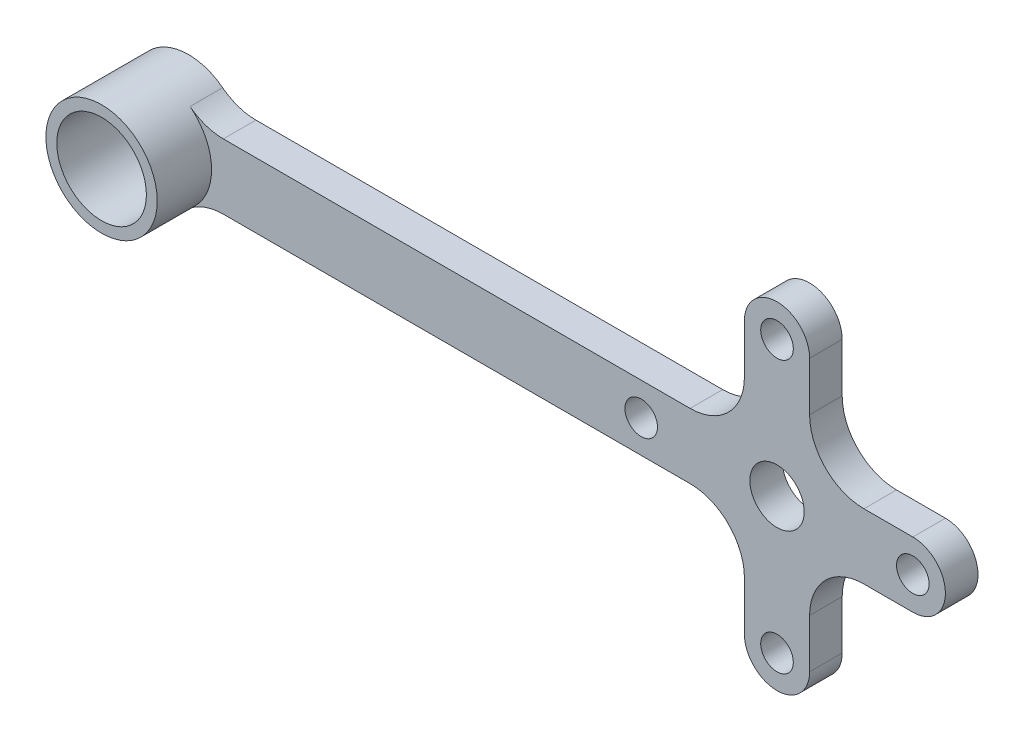
ISO-10303-21;
HEADER;
FILE_DESCRIPTION(('STEP AP214'),'2;1');
FILE_NAME('part.step','',(''),(''),'','','');
FILE_SCHEMA(('AUTOMOTIVE_DESIGN { 1 0 10303 214 1 1 1 1 }'));
ENDSEC;
DATA;
#1=APPLICATION_CONTEXT('core data for automotive mechanical design processes');
#2=APPLICATION_PROTOCOL_DEFINITION('international standard','automotive_design',2000,#1);
#3=PRODUCT_CONTEXT('',#1,'mechanical');
#4=PRODUCT('Part','Part','',(#3));
#5=PRODUCT_RELATED_PRODUCT_CATEGORY('part','',(#4));
#6=PRODUCT_DEFINITION_FORMATION('','',#4);
#7=PRODUCT_DEFINITION_CONTEXT('part definition',#1,'design');
#8=PRODUCT_DEFINITION('design','',#6,#7);
#9=PRODUCT_DEFINITION_SHAPE('','',#8);
#10=(LENGTH_UNIT() NAMED_UNIT(*) SI_UNIT(.MILLI.,.METRE.));
#11=(NAMED_UNIT(*) PLANE_ANGLE_UNIT() SI_UNIT($,.RADIAN.));
#12=(NAMED_UNIT(*) SI_UNIT($,.STERADIAN.) SOLID_ANGLE_UNIT());
#13=UNCERTAINTY_MEASURE_WITH_UNIT(LENGTH_MEASURE(1.E-05),#10,'distance_accuracy_value','');
#14=(GEOMETRIC_REPRESENTATION_CONTEXT(3) GLOBAL_UNCERTAINTY_ASSIGNED_CONTEXT((#13)) GLOBAL_UNIT_ASSIGNED_CONTEXT((#10,
#11,#12)) REPRESENTATION_CONTEXT('',''));
#15=CARTESIAN_POINT('',(0.,0.,0.));
#16=DIRECTION('',(0.,0.,1.));
#17=DIRECTION('',(1.,0.,0.));
#18=AXIS2_PLACEMENT_3D('',#15,#16,#17);
#19=CARTESIAN_POINT('',(0.,-3.,1.5));
#20=DIRECTION('',(0.,1.,0.));
#21=DIRECTION('',(-1.,0.,0.));
#22=AXIS2_PLACEMENT_3D('',#19,#20,#21);
#23=PLANE('',#22);
#24=DIRECTION('',(1.,0.,0.));
#25=VECTOR('',#24,1.);
#26=CARTESIAN_POINT('',(0.,-3.,1.5));
#27=LINE('',#26,#25);
#28=CARTESIAN_POINT('',(8.,-3.,1.5));
#29=VERTEX_POINT('',#28);
#30=CARTESIAN_POINT('',(12.5,-3.,1.5));
#31=VERTEX_POINT('',#30);
#32=EDGE_CURVE('E157',#29,#31,#27,.T.);
#33=ORIENTED_EDGE('',*,*,#32,.F.);
#34=DIRECTION('',(0.,0.,-1.));
#35=VECTOR('',#34,1.);
#36=CARTESIAN_POINT('',(8.,-3.,1.5));
#37=LINE('',#36,#35);
#38=CARTESIAN_POINT('',(8.,-3.,-1.5));
#39=VERTEX_POINT('',#38);
#40=EDGE_CURVE('E189',#29,#39,#37,.T.);
#41=ORIENTED_EDGE('',*,*,#40,.T.);
#42=DIRECTION('',(1.,0.,0.));
#43=VECTOR('',#42,1.);
#44=CARTESIAN_POINT('',(0.,-3.,-1.5));
#45=LINE('',#44,#43);
#46=CARTESIAN_POINT('',(12.5,-3.,-1.5));
#47=VERTEX_POINT('',#46);
#48=EDGE_CURVE('E187',#39,#47,#45,.T.);
#49=ORIENTED_EDGE('',*,*,#48,.T.);
#50=DIRECTION('',(0.,0.,-1.));
#51=VECTOR('',#50,1.);
#52=CARTESIAN_POINT('',(12.5,-3.,1.5));
#53=LINE('',#52,#51);
#54=EDGE_CURVE('E179',#31,#47,#53,.T.);
#55=ORIENTED_EDGE('',*,*,#54,.F.);
#56=EDGE_LOOP('',(#33,#41,#49,#55));
#57=FACE_BOUND('',#56,.T.);
#58=ADVANCED_FACE('F39',(#57),#23,.F.);
#59=CARTESIAN_POINT('',(12.5,0.,1.5));
#60=DIRECTION('',(0.,0.,-1.));
#61=DIRECTION('',(-1.,0.,0.));
#62=AXIS2_PLACEMENT_3D('',#59,#60,#61);
#63=CYLINDRICAL_SURFACE('',#62,3.);
#64=CARTESIAN_POINT('',(12.5,0.,-1.5));
#65=DIRECTION('',(0.,0.,1.));
#66=DIRECTION('',(1.,0.,0.));
#67=AXIS2_PLACEMENT_3D('',#64,#65,#66);
#68=CIRCLE('',#67,3.);
#69=CARTESIAN_POINT('',(12.5,3.,-1.5));
#70=VERTEX_POINT('',#69);
#71=EDGE_CURVE('E321',#47,#70,#68,.T.);
#72=ORIENTED_EDGE('',*,*,#71,.T.);
#73=DIRECTION('',(0.,0.,-1.));
#74=VECTOR('',#73,1.);
#75=CARTESIAN_POINT('',(12.5,3.,1.5));
#76=LINE('',#75,#74);
#77=CARTESIAN_POINT('',(12.5,3.,1.5));
#78=VERTEX_POINT('',#77);
#79=EDGE_CURVE('E185',#78,#70,#76,.T.);
#80=ORIENTED_EDGE('',*,*,#79,.F.);
#81=CARTESIAN_POINT('',(12.5,0.,1.5));
#82=DIRECTION('',(0.,0.,1.));
#83=DIRECTION('',(1.,0.,0.));
#84=AXIS2_PLACEMENT_3D('',#81,#82,#83);
#85=CIRCLE('',#84,3.);
#86=EDGE_CURVE('E164',#31,#78,#85,.T.);
#87=ORIENTED_EDGE('',*,*,#86,.F.);
#88=ORIENTED_EDGE('',*,*,#54,.T.);
#89=EDGE_LOOP('',(#72,#80,#87,#88));
#90=FACE_BOUND('',#89,.T.);
#91=ADVANCED_FACE('F177',(#90),#63,.T.);
#92=CARTESIAN_POINT('',(0.,3.,1.5));
#93=DIRECTION('',(0.,1.,0.));
#94=DIRECTION('',(-1.,0.,0.));
#95=AXIS2_PLACEMENT_3D('',#92,#93,#94);
#96=PLANE('',#95);
#97=DIRECTION('',(1.,0.,0.));
#98=VECTOR('',#97,1.);
#99=CARTESIAN_POINT('',(0.,3.,-1.5));
#100=LINE('',#99,#98);
#101=CARTESIAN_POINT('',(8.,3.,-1.5));
#102=VERTEX_POINT('',#101);
#103=EDGE_CURVE('E323',#102,#70,#100,.T.);
#104=ORIENTED_EDGE('',*,*,#103,.F.);
#105=DIRECTION('',(0.,0.,-1.));
#106=VECTOR('',#105,1.);
#107=CARTESIAN_POINT('',(8.,3.,1.5));
#108=LINE('',#107,#106);
#109=CARTESIAN_POINT('',(8.,3.,1.5));
#110=VERTEX_POINT('',#109);
#111=EDGE_CURVE('E212',#102,#110,#108,.F.);
#112=ORIENTED_EDGE('',*,*,#111,.T.);
#113=DIRECTION('',(1.,0.,0.));
#114=VECTOR('',#113,1.);
#115=CARTESIAN_POINT('',(0.,3.,1.5));
#116=LINE('',#115,#114);
#117=EDGE_CURVE('E182',#110,#78,#116,.T.);
#118=ORIENTED_EDGE('',*,*,#117,.T.);
#119=ORIENTED_EDGE('',*,*,#79,.T.);
#120=EDGE_LOOP('',(#104,#112,#118,#119));
#121=FACE_BOUND('',#120,.T.);
#122=ADVANCED_FACE('F368',(#121),#96,.T.);
#123=CARTESIAN_POINT('',(3.,0.,1.5));
#124=DIRECTION('',(1.,0.,0.));
#125=DIRECTION('',(0.,1.,0.));
#126=AXIS2_PLACEMENT_3D('',#123,#124,#125);
#127=PLANE('',#126);
#128=DIRECTION('',(0.,-1.,0.));
#129=VECTOR('',#128,1.);
#130=CARTESIAN_POINT('',(3.,0.,1.5));
#131=LINE('',#130,#129);
#132=CARTESIAN_POINT('',(3.,12.5,1.5));
#133=VERTEX_POINT('',#132);
#134=CARTESIAN_POINT('',(3.,8.,1.5));
#135=VERTEX_POINT('',#134);
#136=EDGE_CURVE('E287',#133,#135,#131,.T.);
#137=ORIENTED_EDGE('',*,*,#136,.T.);
#138=DIRECTION('',(0.,0.,-1.));
#139=VECTOR('',#138,1.);
#140=CARTESIAN_POINT('',(3.,8.,-1.5));
#141=LINE('',#140,#139);
#142=CARTESIAN_POINT('',(3.,8.,-1.5));
#143=VERTEX_POINT('',#142);
#144=EDGE_CURVE('E211',#135,#143,#141,.T.);
#145=ORIENTED_EDGE('',*,*,#144,.T.);
#146=DIRECTION('',(0.,-1.,0.));
#147=VECTOR('',#146,1.);
#148=CARTESIAN_POINT('',(3.,0.,-1.5));
#149=LINE('',#148,#147);
#150=CARTESIAN_POINT('',(3.,12.5,-1.5));
#151=VERTEX_POINT('',#150);
#152=EDGE_CURVE('E326',#151,#143,#149,.T.);
#153=ORIENTED_EDGE('',*,*,#152,.F.);
#154=DIRECTION('',(0.,0.,-1.));
#155=VECTOR('',#154,1.);
#156=CARTESIAN_POINT('',(3.,12.5,1.5));
#157=LINE('',#156,#155);
#158=EDGE_CURVE('E191',#133,#151,#157,.T.);
#159=ORIENTED_EDGE('',*,*,#158,.F.);
#160=EDGE_LOOP('',(#137,#145,#153,#159));
#161=FACE_BOUND('',#160,.T.);
#162=ADVANCED_FACE('F359',(#161),#127,.T.);
#163=CARTESIAN_POINT('',(0.,12.5,1.5));
#164=DIRECTION('',(0.,0.,-1.));
#165=DIRECTION('',(-1.,0.,0.));
#166=AXIS2_PLACEMENT_3D('',#163,#164,#165);
#167=CYLINDRICAL_SURFACE('',#166,3.00000000000001);
#168=CARTESIAN_POINT('',(0.,12.5,-1.5));
#169=DIRECTION('',(0.,0.,1.));
#170=DIRECTION('',(1.,0.,0.));
#171=AXIS2_PLACEMENT_3D('',#168,#169,#170);
#172=CIRCLE('',#171,3.00000000000001);
#173=CARTESIAN_POINT('',(-3.00000000000002,12.5,-1.5));
#174=VERTEX_POINT('',#173);
#175=EDGE_CURVE('E328',#151,#174,#172,.T.);
#176=ORIENTED_EDGE('',*,*,#175,.T.);
#177=DIRECTION('',(0.,0.,-1.));
#178=VECTOR('',#177,1.);
#179=CARTESIAN_POINT('',(-3.00000000000002,12.5,1.5));
#180=LINE('',#179,#178);
#181=CARTESIAN_POINT('',(-3.00000000000002,12.5,1.5));
#182=VERTEX_POINT('',#181);
#183=EDGE_CURVE('E348',#182,#174,#180,.T.);
#184=ORIENTED_EDGE('',*,*,#183,.F.);
#185=CARTESIAN_POINT('',(0.,12.5,1.5));
#186=DIRECTION('',(0.,0.,1.));
#187=DIRECTION('',(1.,0.,0.));
#188=AXIS2_PLACEMENT_3D('',#185,#186,#187);
#189=CIRCLE('',#188,3.00000000000001);
#190=EDGE_CURVE('E291',#133,#182,#189,.T.);
#191=ORIENTED_EDGE('',*,*,#190,.F.);
#192=ORIENTED_EDGE('',*,*,#158,.T.);
#193=EDGE_LOOP('',(#176,#184,#191,#192));
#194=FACE_BOUND('',#193,.T.);
#195=ADVANCED_FACE('F354',(#194),#167,.T.);
#196=CARTESIAN_POINT('',(-3.00000000000001,0.,1.5));
#197=DIRECTION('',(1.,0.,0.));
#198=DIRECTION('',(0.,1.,0.));
#199=AXIS2_PLACEMENT_3D('',#196,#197,#198);
#200=PLANE('',#199);
#201=DIRECTION('',(0.,-1.,0.));
#202=VECTOR('',#201,1.);
#203=CARTESIAN_POINT('',(-3.00000000000001,0.,-1.5));
#204=LINE('',#203,#202);
#205=CARTESIAN_POINT('',(-3.00000000000001,8.,-1.5));
#206=VERTEX_POINT('',#205);
#207=EDGE_CURVE('E332',#174,#206,#204,.T.);
#208=ORIENTED_EDGE('',*,*,#207,.T.);
#209=DIRECTION('',(0.,0.,-1.));
#210=VECTOR('',#209,1.);
#211=CARTESIAN_POINT('',(-3.00000000000001,8.,1.5));
#212=LINE('',#211,#210);
#213=CARTESIAN_POINT('',(-3.00000000000001,8.,1.5));
#214=VERTEX_POINT('',#213);
#215=EDGE_CURVE('E208',#206,#214,#212,.F.);
#216=ORIENTED_EDGE('',*,*,#215,.T.);
#217=DIRECTION('',(0.,-1.,0.));
#218=VECTOR('',#217,1.);
#219=CARTESIAN_POINT('',(-3.00000000000001,0.,1.5));
#220=LINE('',#219,#218);
#221=EDGE_CURVE('E294',#182,#214,#220,.T.);
#222=ORIENTED_EDGE('',*,*,#221,.F.);
#223=ORIENTED_EDGE('',*,*,#183,.T.);
#224=EDGE_LOOP('',(#208,#216,#222,#223));
#225=FACE_BOUND('',#224,.T.);
#226=ADVANCED_FACE('F455',(#225),#200,.F.);
#227=CARTESIAN_POINT('',(0.,3.,1.5));
#228=DIRECTION('',(0.,-1.,0.));
#229=DIRECTION('',(1.,0.,0.));
#230=AXIS2_PLACEMENT_3D('',#227,#228,#229);
#231=PLANE('',#230);
#232=DIRECTION('',(-1.,0.,0.));
#233=VECTOR('',#232,1.);
#234=CARTESIAN_POINT('',(0.,3.,1.5));
#235=LINE('',#234,#233);
#236=CARTESIAN_POINT('',(-8.00000000000001,3.,1.5));
#237=VERTEX_POINT('',#236);
#238=CARTESIAN_POINT('',(-50.9639042063468,2.99999999999999,1.5));
#239=VERTEX_POINT('',#238);
#240=EDGE_CURVE('E255',#237,#239,#235,.T.);
#241=ORIENTED_EDGE('',*,*,#240,.F.);
#242=DIRECTION('',(0.,0.,-1.));
#243=VECTOR('',#242,1.);
#244=CARTESIAN_POINT('',(-8.00000000000001,3.,-1.5));
#245=LINE('',#244,#243);
#246=CARTESIAN_POINT('',(-8.00000000000001,3.,-1.5));
#247=VERTEX_POINT('',#246);
#248=EDGE_CURVE('E210',#237,#247,#245,.T.);
#249=ORIENTED_EDGE('',*,*,#248,.T.);
#250=DIRECTION('',(-1.,0.,0.));
#251=VECTOR('',#250,1.);
#252=CARTESIAN_POINT('',(0.,3.,-1.5));
#253=LINE('',#252,#251);
#254=CARTESIAN_POINT('',(-50.9639042063468,2.99999999999999,-1.5));
#255=VERTEX_POINT('',#254);
#256=EDGE_CURVE('E334',#247,#255,#253,.T.);
#257=ORIENTED_EDGE('',*,*,#256,.T.);
#258=DIRECTION('',(0.,0.,1.));
#259=VECTOR('',#258,1.);
#260=CARTESIAN_POINT('',(-50.9639042063468,2.99999999999999,1.5));
#261=LINE('',#260,#259);
#262=EDGE_CURVE('E204',#255,#239,#261,.T.);
#263=ORIENTED_EDGE('',*,*,#262,.T.);
#264=EDGE_LOOP('',(#241,#249,#257,#263));
#265=FACE_BOUND('',#264,.T.);
#266=ADVANCED_FACE('F448',(#265),#231,.F.);
#267=CARTESIAN_POINT('',(0.,-3.,1.5));
#268=DIRECTION('',(0.,-1.,0.));
#269=DIRECTION('',(1.,0.,0.));
#270=AXIS2_PLACEMENT_3D('',#267,#268,#269);
#271=PLANE('',#270);
#272=DIRECTION('',(-1.,0.,0.));
#273=VECTOR('',#272,1.);
#274=CARTESIAN_POINT('',(0.,-3.,-1.5));
#275=LINE('',#274,#273);
#276=CARTESIAN_POINT('',(-8.00000000000001,-3.,-1.5));
#277=VERTEX_POINT('',#276);
#278=CARTESIAN_POINT('',(-50.9639042063468,-3.00000000000001,-1.5));
#279=VERTEX_POINT('',#278);
#280=EDGE_CURVE('E265',#277,#279,#275,.T.);
#281=ORIENTED_EDGE('',*,*,#280,.F.);
#282=DIRECTION('',(0.,0.,-1.));
#283=VECTOR('',#282,1.);
#284=CARTESIAN_POINT('',(-8.00000000000001,-3.,1.5));
#285=LINE('',#284,#283);
#286=CARTESIAN_POINT('',(-8.00000000000001,-3.,1.5));
#287=VERTEX_POINT('',#286);
#288=EDGE_CURVE('E205',#277,#287,#285,.F.);
#289=ORIENTED_EDGE('',*,*,#288,.T.);
#290=DIRECTION('',(-1.,0.,0.));
#291=VECTOR('',#290,1.);
#292=CARTESIAN_POINT('',(0.,-3.,1.5));
#293=LINE('',#292,#291);
#294=CARTESIAN_POINT('',(-50.9639042063468,-3.00000000000001,1.5));
#295=VERTEX_POINT('',#294);
#296=EDGE_CURVE('E241',#287,#295,#293,.T.);
#297=ORIENTED_EDGE('',*,*,#296,.T.);
#298=DIRECTION('',(0.,0.,-1.));
#299=VECTOR('',#298,1.);
#300=CARTESIAN_POINT('',(-50.9639042063468,-3.00000000000001,-1.5));
#301=LINE('',#300,#299);
#302=EDGE_CURVE('E199',#295,#279,#301,.T.);
#303=ORIENTED_EDGE('',*,*,#302,.T.);
#304=EDGE_LOOP('',(#281,#289,#297,#303));
#305=FACE_BOUND('',#304,.T.);
#306=ADVANCED_FACE('F247',(#305),#271,.T.);
#307=CARTESIAN_POINT('',(-3.00000000000001,0.,1.5));
#308=DIRECTION('',(1.,0.,0.));
#309=DIRECTION('',(0.,1.,0.));
#310=AXIS2_PLACEMENT_3D('',#307,#308,#309);
#311=PLANE('',#310);
#312=DIRECTION('',(0.,-1.,0.));
#313=VECTOR('',#312,1.);
#314=CARTESIAN_POINT('',(-3.00000000000001,0.,1.5));
#315=LINE('',#314,#313);
#316=CARTESIAN_POINT('',(-3.00000000000001,-8.,1.5));
#317=VERTEX_POINT('',#316);
#318=CARTESIAN_POINT('',(-3.00000000000001,-12.5,1.5));
#319=VERTEX_POINT('',#318);
#320=EDGE_CURVE('E252',#317,#319,#315,.T.);
#321=ORIENTED_EDGE('',*,*,#320,.F.);
#322=DIRECTION('',(0.,0.,-1.));
#323=VECTOR('',#322,1.);
#324=CARTESIAN_POINT('',(-3.00000000000001,-8.,1.5));
#325=LINE('',#324,#323);
#326=CARTESIAN_POINT('',(-3.00000000000001,-8.,-1.5));
#327=VERTEX_POINT('',#326);
#328=EDGE_CURVE('E200',#317,#327,#325,.T.);
#329=ORIENTED_EDGE('',*,*,#328,.T.);
#330=DIRECTION('',(0.,-1.,0.));
#331=VECTOR('',#330,1.);
#332=CARTESIAN_POINT('',(-3.00000000000001,0.,-1.5));
#333=LINE('',#332,#331);
#334=CARTESIAN_POINT('',(-3.00000000000001,-12.5,-1.5));
#335=VERTEX_POINT('',#334);
#336=EDGE_CURVE('E336',#327,#335,#333,.T.);
#337=ORIENTED_EDGE('',*,*,#336,.T.);
#338=DIRECTION('',(0.,0.,-1.));
#339=VECTOR('',#338,1.);
#340=CARTESIAN_POINT('',(-3.00000000000001,-12.5,1.5));
#341=LINE('',#340,#339);
#342=EDGE_CURVE('E346',#319,#335,#341,.T.);
#343=ORIENTED_EDGE('',*,*,#342,.F.);
#344=EDGE_LOOP('',(#321,#329,#337,#343));
#345=FACE_BOUND('',#344,.T.);
#346=ADVANCED_FACE('F442',(#345),#311,.F.);
#347=CARTESIAN_POINT('',(-1.29195826730641E-13,-12.5,1.5));
#348=DIRECTION('',(0.,0.,-1.));
#349=DIRECTION('',(-1.,0.,0.));
#350=AXIS2_PLACEMENT_3D('',#347,#348,#349);
#351=CYLINDRICAL_SURFACE('',#350,3.00000000000001);
#352=CARTESIAN_POINT('',(-1.29195826730641E-13,-12.5,-1.5));
#353=DIRECTION('',(0.,0.,1.));
#354=DIRECTION('',(1.,0.,0.));
#355=AXIS2_PLACEMENT_3D('',#352,#353,#354);
#356=CIRCLE('',#355,3.00000000000001);
#357=CARTESIAN_POINT('',(3.,-12.5,-1.5));
#358=VERTEX_POINT('',#357);
#359=EDGE_CURVE('E338',#335,#358,#356,.T.);
#360=ORIENTED_EDGE('',*,*,#359,.T.);
#361=DIRECTION('',(0.,0.,-1.));
#362=VECTOR('',#361,1.);
#363=CARTESIAN_POINT('',(3.,-12.5,1.5));
#364=LINE('',#363,#362);
#365=CARTESIAN_POINT('',(3.,-12.5,1.5));
#366=VERTEX_POINT('',#365);
#367=EDGE_CURVE('E306',#366,#358,#364,.T.);
#368=ORIENTED_EDGE('',*,*,#367,.F.);
#369=CARTESIAN_POINT('',(-1.29195826730641E-13,-12.5,1.5));
#370=DIRECTION('',(0.,0.,1.));
#371=DIRECTION('',(1.,0.,0.));
#372=AXIS2_PLACEMENT_3D('',#369,#370,#371);
#373=CIRCLE('',#372,3.00000000000001);
#374=EDGE_CURVE('E301',#319,#366,#373,.T.);
#375=ORIENTED_EDGE('',*,*,#374,.F.);
#376=ORIENTED_EDGE('',*,*,#342,.T.);
#377=EDGE_LOOP('',(#360,#368,#375,#376));
#378=FACE_BOUND('',#377,.T.);
#379=ADVANCED_FACE('F409',(#378),#351,.T.);
#380=CARTESIAN_POINT('',(-1.29195826730641E-13,-12.5,1.5));
#381=DIRECTION('',(0.,0.,-1.));
#382=DIRECTION('',(-1.,0.,0.));
#383=AXIS2_PLACEMENT_3D('',#380,#381,#382);
#384=CYLINDRICAL_SURFACE('',#383,1.49999999999994);
#385=CARTESIAN_POINT('',(-1.29195826730641E-13,-12.5,1.5));
#386=DIRECTION('',(0.,0.,1.));
#387=DIRECTION('',(1.,0.,0.));
#388=AXIS2_PLACEMENT_3D('',#385,#386,#387);
#389=CIRCLE('',#388,1.49999999999994);
#390=CARTESIAN_POINT('',(1.49999999999981,-12.5,1.5));
#391=VERTEX_POINT('',#390);
#392=EDGE_CURVE('E172',#391,#391,#389,.T.);
#393=ORIENTED_EDGE('',*,*,#392,.T.);
#394=EDGE_LOOP('',(#393));
#395=FACE_BOUND('',#394,.T.);
#396=CARTESIAN_POINT('',(-1.29195826730641E-13,-12.5,-1.5));
#397=DIRECTION('',(0.,0.,1.));
#398=DIRECTION('',(1.,0.,0.));
#399=AXIS2_PLACEMENT_3D('',#396,#397,#398);
#400=CIRCLE('',#399,1.49999999999994);
#401=CARTESIAN_POINT('',(1.49999999999981,-12.5,-1.5));
#402=VERTEX_POINT('',#401);
#403=EDGE_CURVE('E319',#402,#402,#400,.T.);
#404=ORIENTED_EDGE('',*,*,#403,.F.);
#405=EDGE_LOOP('',(#404));
#406=FACE_BOUND('',#405,.T.);
#407=ADVANCED_FACE('F405',(#395,#406),#384,.F.);
#408=CARTESIAN_POINT('',(12.5,0.,1.5));
#409=DIRECTION('',(0.,0.,-1.));
#410=DIRECTION('',(-1.,0.,0.));
#411=AXIS2_PLACEMENT_3D('',#408,#409,#410);
#412=CYLINDRICAL_SURFACE('',#411,1.49999999999994);
#413=CARTESIAN_POINT('',(12.5,0.,1.5));
#414=DIRECTION('',(0.,0.,1.));
#415=DIRECTION('',(1.,0.,0.));
#416=AXIS2_PLACEMENT_3D('',#413,#414,#415);
#417=CIRCLE('',#416,1.49999999999994);
#418=CARTESIAN_POINT('',(13.9999999999999,0.,1.5));
#419=VERTEX_POINT('',#418);
#420=EDGE_CURVE('E283',#419,#419,#417,.T.);
#421=ORIENTED_EDGE('',*,*,#420,.T.);
#422=EDGE_LOOP('',(#421));
#423=FACE_BOUND('',#422,.T.);
#424=CARTESIAN_POINT('',(12.5,0.,-1.5));
#425=DIRECTION('',(0.,0.,1.));
#426=DIRECTION('',(1.,0.,0.));
#427=AXIS2_PLACEMENT_3D('',#424,#425,#426);
#428=CIRCLE('',#427,1.49999999999994);
#429=CARTESIAN_POINT('',(13.9999999999999,0.,-1.5));
#430=VERTEX_POINT('',#429);
#431=EDGE_CURVE('E314',#430,#430,#428,.T.);
#432=ORIENTED_EDGE('',*,*,#431,.F.);
#433=EDGE_LOOP('',(#432));
#434=FACE_BOUND('',#433,.T.);
#435=ADVANCED_FACE('F403',(#423,#434),#412,.F.);
#436=CARTESIAN_POINT('',(0.,12.5,1.5));
#437=DIRECTION('',(0.,0.,-1.));
#438=DIRECTION('',(-1.,0.,0.));
#439=AXIS2_PLACEMENT_3D('',#436,#437,#438);
#440=CYLINDRICAL_SURFACE('',#439,1.49999999999994);
#441=CARTESIAN_POINT('',(0.,12.5,1.5));
#442=DIRECTION('',(0.,0.,1.));
#443=DIRECTION('',(1.,0.,0.));
#444=AXIS2_PLACEMENT_3D('',#441,#442,#443);
#445=CIRCLE('',#444,1.49999999999994);
#446=CARTESIAN_POINT('',(1.49999999999998,12.5,1.5));
#447=VERTEX_POINT('',#446);
#448=EDGE_CURVE('E281',#447,#447,#445,.T.);
#449=ORIENTED_EDGE('',*,*,#448,.T.);
#450=EDGE_LOOP('',(#449));
#451=FACE_BOUND('',#450,.T.);
#452=CARTESIAN_POINT('',(0.,12.5,-1.5));
#453=DIRECTION('',(0.,0.,1.));
#454=DIRECTION('',(1.,0.,0.));
#455=AXIS2_PLACEMENT_3D('',#452,#453,#454);
#456=CIRCLE('',#455,1.49999999999994);
#457=CARTESIAN_POINT('',(1.49999999999998,12.5,-1.5));
#458=VERTEX_POINT('',#457);
#459=EDGE_CURVE('E315',#458,#458,#456,.T.);
#460=ORIENTED_EDGE('',*,*,#459,.F.);
#461=EDGE_LOOP('',(#460));
#462=FACE_BOUND('',#461,.T.);
#463=ADVANCED_FACE('F407',(#451,#462),#440,.F.);
#464=CARTESIAN_POINT('',(-12.5,0.,1.5));
#465=DIRECTION('',(0.,0.,-1.));
#466=DIRECTION('',(-1.,0.,0.));
#467=AXIS2_PLACEMENT_3D('',#464,#465,#466);
#468=CYLINDRICAL_SURFACE('',#467,1.49999999999994);
#469=CARTESIAN_POINT('',(-12.5,0.,1.5));
#470=DIRECTION('',(0.,0.,1.));
#471=DIRECTION('',(1.,0.,0.));
#472=AXIS2_PLACEMENT_3D('',#469,#470,#471);
#473=CIRCLE('',#472,1.49999999999994);
#474=CARTESIAN_POINT('',(-11.0000000000001,0.,1.5));
#475=VERTEX_POINT('',#474);
#476=EDGE_CURVE('E276',#475,#475,#473,.T.);
#477=ORIENTED_EDGE('',*,*,#476,.T.);
#478=EDGE_LOOP('',(#477));
#479=FACE_BOUND('',#478,.T.);
#480=CARTESIAN_POINT('',(-12.5,0.,-1.5));
#481=DIRECTION('',(0.,0.,1.));
#482=DIRECTION('',(1.,0.,0.));
#483=AXIS2_PLACEMENT_3D('',#480,#481,#482);
#484=CIRCLE('',#483,1.49999999999994);
#485=CARTESIAN_POINT('',(-11.0000000000001,0.,-1.5));
#486=VERTEX_POINT('',#485);
#487=EDGE_CURVE('E307',#486,#486,#484,.T.);
#488=ORIENTED_EDGE('',*,*,#487,.F.);
#489=EDGE_LOOP('',(#488));
#490=FACE_BOUND('',#489,.T.);
#491=ADVANCED_FACE('F413',(#479,#490),#468,.F.);
#492=CARTESIAN_POINT('',(0.,0.,1.5));
#493=DIRECTION('',(0.,0.,-1.));
#494=DIRECTION('',(-1.,0.,0.));
#495=AXIS2_PLACEMENT_3D('',#492,#493,#494);
#496=CYLINDRICAL_SURFACE('',#495,2.5);
#497=CARTESIAN_POINT('',(0.,0.,1.5));
#498=DIRECTION('',(0.,0.,1.));
#499=DIRECTION('',(1.,0.,0.));
#500=AXIS2_PLACEMENT_3D('',#497,#498,#499);
#501=CIRCLE('',#500,2.5);
#502=CARTESIAN_POINT('',(2.5,0.,1.5));
#503=VERTEX_POINT('',#502);
#504=EDGE_CURVE('E274',#503,#503,#501,.T.);
#505=ORIENTED_EDGE('',*,*,#504,.T.);
#506=EDGE_LOOP('',(#505));
#507=FACE_BOUND('',#506,.T.);
#508=CARTESIAN_POINT('',(0.,0.,-1.5));
#509=DIRECTION('',(0.,0.,1.));
#510=DIRECTION('',(1.,0.,0.));
#511=AXIS2_PLACEMENT_3D('',#508,#509,#510);
#512=CIRCLE('',#511,2.5);
#513=CARTESIAN_POINT('',(2.5,0.,-1.5));
#514=VERTEX_POINT('',#513);
#515=EDGE_CURVE('E270',#514,#514,#512,.T.);
#516=ORIENTED_EDGE('',*,*,#515,.F.);
#517=EDGE_LOOP('',(#516));
#518=FACE_BOUND('',#517,.T.);
#519=ADVANCED_FACE('F420',(#507,#518),#496,.F.);
#520=CARTESIAN_POINT('',(3.,0.,1.5));
#521=DIRECTION('',(1.,0.,0.));
#522=DIRECTION('',(0.,1.,0.));
#523=AXIS2_PLACEMENT_3D('',#520,#521,#522);
#524=PLANE('',#523);
#525=DIRECTION('',(0.,-1.,0.));
#526=VECTOR('',#525,1.);
#527=CARTESIAN_POINT('',(3.,0.,-1.5));
#528=LINE('',#527,#526);
#529=CARTESIAN_POINT('',(3.,-8.,-1.5));
#530=VERTEX_POINT('',#529);
#531=EDGE_CURVE('E280',#530,#358,#528,.T.);
#532=ORIENTED_EDGE('',*,*,#531,.F.);
#533=DIRECTION('',(0.,0.,-1.));
#534=VECTOR('',#533,1.);
#535=CARTESIAN_POINT('',(3.,-8.,1.5));
#536=LINE('',#535,#534);
#537=CARTESIAN_POINT('',(3.,-8.,1.5));
#538=VERTEX_POINT('',#537);
#539=EDGE_CURVE('E188',#530,#538,#536,.F.);
#540=ORIENTED_EDGE('',*,*,#539,.T.);
#541=DIRECTION('',(0.,-1.,0.));
#542=VECTOR('',#541,1.);
#543=CARTESIAN_POINT('',(3.,0.,1.5));
#544=LINE('',#543,#542);
#545=EDGE_CURVE('E302',#538,#366,#544,.T.);
#546=ORIENTED_EDGE('',*,*,#545,.T.);
#547=ORIENTED_EDGE('',*,*,#367,.T.);
#548=EDGE_LOOP('',(#532,#540,#546,#547));
#549=FACE_BOUND('',#548,.T.);
#550=ADVANCED_FACE('F372',(#549),#524,.T.);
#551=CARTESIAN_POINT('',(0.,0.,1.5));
#552=DIRECTION('',(0.,0.,1.));
#553=DIRECTION('',(1.,0.,0.));
#554=AXIS2_PLACEMENT_3D('',#551,#552,#553);
#555=PLANE('',#554);
#556=CARTESIAN_POINT('',(-57.17,0.,1.5));
#557=DIRECTION('',(0.,0.,1.));
#558=DIRECTION('',(1.,0.,0.));
#559=AXIS2_PLACEMENT_3D('',#556,#557,#558);
#560=CIRCLE('',#559,5.125);
#561=CARTESIAN_POINT('',(-54.0286428698792,-4.04938271604939,1.5));
#562=VERTEX_POINT('',#561);
#563=CARTESIAN_POINT('',(-54.0286428698792,4.04938271604937,1.5));
#564=VERTEX_POINT('',#563);
#565=EDGE_CURVE('E53',#562,#564,#560,.T.);
#566=ORIENTED_EDGE('',*,*,#565,.F.);
#567=CARTESIAN_POINT('',(-50.9639042063468,-8.00000000000001,1.5));
#568=DIRECTION('',(0.,0.,1.));
#569=DIRECTION('',(1.,0.,0.));
#570=AXIS2_PLACEMENT_3D('',#567,#568,#569);
#571=CIRCLE('',#570,5.);
#572=EDGE_CURVE('E50',#562,#295,#571,.F.);
#573=ORIENTED_EDGE('',*,*,#572,.T.);
#574=ORIENTED_EDGE('',*,*,#296,.F.);
#575=CARTESIAN_POINT('',(-8.00000000000001,-8.,1.5));
#576=DIRECTION('',(0.,0.,1.));
#577=DIRECTION('',(1.,0.,0.));
#578=AXIS2_PLACEMENT_3D('',#575,#576,#577);
#579=CIRCLE('',#578,5.);
#580=EDGE_CURVE('E228',#287,#317,#579,.F.);
#581=ORIENTED_EDGE('',*,*,#580,.T.);
#582=ORIENTED_EDGE('',*,*,#320,.T.);
#583=ORIENTED_EDGE('',*,*,#374,.T.);
#584=ORIENTED_EDGE('',*,*,#545,.F.);
#585=CARTESIAN_POINT('',(8.,-8.,1.5));
#586=DIRECTION('',(0.,0.,1.));
#587=DIRECTION('',(1.,0.,0.));
#588=AXIS2_PLACEMENT_3D('',#585,#586,#587);
#589=CIRCLE('',#588,5.);
#590=EDGE_CURVE('E169',#538,#29,#589,.F.);
#591=ORIENTED_EDGE('',*,*,#590,.T.);
#592=ORIENTED_EDGE('',*,*,#32,.T.);
#593=ORIENTED_EDGE('',*,*,#86,.T.);
#594=ORIENTED_EDGE('',*,*,#117,.F.);
#595=CARTESIAN_POINT('',(8.,8.,1.5));
#596=DIRECTION('',(0.,0.,1.));
#597=DIRECTION('',(1.,0.,0.));
#598=AXIS2_PLACEMENT_3D('',#595,#596,#597);
#599=CIRCLE('',#598,5.);
#600=EDGE_CURVE('E234',#110,#135,#599,.F.);
#601=ORIENTED_EDGE('',*,*,#600,.T.);
#602=ORIENTED_EDGE('',*,*,#136,.F.);
#603=ORIENTED_EDGE('',*,*,#190,.T.);
#604=ORIENTED_EDGE('',*,*,#221,.T.);
#605=CARTESIAN_POINT('',(-8.00000000000001,8.,1.5));
#606=DIRECTION('',(0.,0.,1.));
#607=DIRECTION('',(1.,0.,0.));
#608=AXIS2_PLACEMENT_3D('',#605,#606,#607);
#609=CIRCLE('',#608,5.);
#610=EDGE_CURVE('E229',#214,#237,#609,.F.);
#611=ORIENTED_EDGE('',*,*,#610,.T.);
#612=ORIENTED_EDGE('',*,*,#240,.T.);
#613=CARTESIAN_POINT('',(-50.9639042063468,7.99999999999999,1.5));
#614=DIRECTION('',(0.,0.,1.));
#615=DIRECTION('',(1.,0.,0.));
#616=AXIS2_PLACEMENT_3D('',#613,#614,#615);
#617=CIRCLE('',#616,5.);
#618=EDGE_CURVE('E236',#239,#564,#617,.F.);
#619=ORIENTED_EDGE('',*,*,#618,.T.);
#620=EDGE_LOOP('',(#566,#573,#574,#581,#582,#583,#584,#591,#592,#593,#594,#601,#602,#603,#604,
#611,#612,#619));
#621=FACE_BOUND('',#620,.T.);
#622=ORIENTED_EDGE('',*,*,#504,.F.);
#623=EDGE_LOOP('',(#622));
#624=FACE_BOUND('',#623,.T.);
#625=ORIENTED_EDGE('',*,*,#476,.F.);
#626=EDGE_LOOP('',(#625));
#627=FACE_BOUND('',#626,.T.);
#628=ORIENTED_EDGE('',*,*,#448,.F.);
#629=EDGE_LOOP('',(#628));
#630=FACE_BOUND('',#629,.T.);
#631=ORIENTED_EDGE('',*,*,#420,.F.);
#632=EDGE_LOOP('',(#631));
#633=FACE_BOUND('',#632,.T.);
#634=ORIENTED_EDGE('',*,*,#392,.F.);
#635=EDGE_LOOP('',(#634));
#636=FACE_BOUND('',#635,.T.);
#637=ADVANCED_FACE('F162',(#621,#624,#627,#630,#633,#636),#555,.T.);
#638=CARTESIAN_POINT('',(0.,0.,-1.5));
#639=DIRECTION('',(0.,0.,1.));
#640=DIRECTION('',(1.,0.,0.));
#641=AXIS2_PLACEMENT_3D('',#638,#639,#640);
#642=PLANE('',#641);
#643=CARTESIAN_POINT('',(-57.17,0.,-1.5));
#644=DIRECTION('',(0.,0.,1.));
#645=DIRECTION('',(1.,0.,0.));
#646=AXIS2_PLACEMENT_3D('',#643,#644,#645);
#647=CIRCLE('',#646,4.12500000000001);
#648=CARTESIAN_POINT('',(-53.045,0.,-1.5));
#649=VERTEX_POINT('',#648);
#650=EDGE_CURVE('E266',#649,#649,#647,.T.);
#651=ORIENTED_EDGE('',*,*,#650,.T.);
#652=EDGE_LOOP('',(#651));
#653=FACE_BOUND('',#652,.T.);
#654=ORIENTED_EDGE('',*,*,#280,.T.);
#655=CARTESIAN_POINT('',(-50.9639042063468,-8.00000000000001,-1.5));
#656=DIRECTION('',(0.,0.,1.));
#657=DIRECTION('',(1.,0.,0.));
#658=AXIS2_PLACEMENT_3D('',#655,#656,#657);
#659=CIRCLE('',#658,5.);
#660=CARTESIAN_POINT('',(-54.0286428698792,-4.04938271604939,-1.5));
#661=VERTEX_POINT('',#660);
#662=EDGE_CURVE('E11',#279,#661,#659,.T.);
#663=ORIENTED_EDGE('',*,*,#662,.T.);
#664=CARTESIAN_POINT('',(-57.17,0.,-1.5));
#665=DIRECTION('',(0.,0.,1.));
#666=DIRECTION('',(1.,0.,0.));
#667=AXIS2_PLACEMENT_3D('',#664,#665,#666);
#668=CIRCLE('',#667,5.125);
#669=CARTESIAN_POINT('',(-54.0286428698792,4.04938271604938,-1.5));
#670=VERTEX_POINT('',#669);
#671=EDGE_CURVE('E257',#661,#670,#668,.F.);
#672=ORIENTED_EDGE('',*,*,#671,.T.);
#673=CARTESIAN_POINT('',(-50.9639042063468,7.99999999999999,-1.5));
#674=DIRECTION('',(0.,0.,1.));
#675=DIRECTION('',(1.,0.,0.));
#676=AXIS2_PLACEMENT_3D('',#673,#674,#675);
#677=CIRCLE('',#676,5.);
#678=EDGE_CURVE('E238',#670,#255,#677,.T.);
#679=ORIENTED_EDGE('',*,*,#678,.T.);
#680=ORIENTED_EDGE('',*,*,#256,.F.);
#681=CARTESIAN_POINT('',(-8.00000000000001,8.,-1.5));
#682=DIRECTION('',(0.,0.,1.));
#683=DIRECTION('',(1.,0.,0.));
#684=AXIS2_PLACEMENT_3D('',#681,#682,#683);
#685=CIRCLE('',#684,5.);
#686=EDGE_CURVE('E226',#247,#206,#685,.T.);
#687=ORIENTED_EDGE('',*,*,#686,.T.);
#688=ORIENTED_EDGE('',*,*,#207,.F.);
#689=ORIENTED_EDGE('',*,*,#175,.F.);
#690=ORIENTED_EDGE('',*,*,#152,.T.);
#691=CARTESIAN_POINT('',(8.,8.,-1.5));
#692=DIRECTION('',(0.,0.,1.));
#693=DIRECTION('',(1.,0.,0.));
#694=AXIS2_PLACEMENT_3D('',#691,#692,#693);
#695=CIRCLE('',#694,5.);
#696=EDGE_CURVE('E235',#143,#102,#695,.T.);
#697=ORIENTED_EDGE('',*,*,#696,.T.);
#698=ORIENTED_EDGE('',*,*,#103,.T.);
#699=ORIENTED_EDGE('',*,*,#71,.F.);
#700=ORIENTED_EDGE('',*,*,#48,.F.);
#701=CARTESIAN_POINT('',(8.,-8.,-1.5));
#702=DIRECTION('',(0.,0.,1.));
#703=DIRECTION('',(1.,0.,0.));
#704=AXIS2_PLACEMENT_3D('',#701,#702,#703);
#705=CIRCLE('',#704,5.);
#706=EDGE_CURVE('E223',#39,#530,#705,.T.);
#707=ORIENTED_EDGE('',*,*,#706,.T.);
#708=ORIENTED_EDGE('',*,*,#531,.T.);
#709=ORIENTED_EDGE('',*,*,#359,.F.);
#710=ORIENTED_EDGE('',*,*,#336,.F.);
#711=CARTESIAN_POINT('',(-8.00000000000001,-8.,-1.5));
#712=DIRECTION('',(0.,0.,1.));
#713=DIRECTION('',(1.,0.,0.));
#714=AXIS2_PLACEMENT_3D('',#711,#712,#713);
#715=CIRCLE('',#714,5.);
#716=EDGE_CURVE('E224',#327,#277,#715,.T.);
#717=ORIENTED_EDGE('',*,*,#716,.T.);
#718=EDGE_LOOP('',(#654,#663,#672,#679,#680,#687,#688,#689,#690,#697,#698,#699,#700,#707,#708,
#709,#710,#717));
#719=FACE_BOUND('',#718,.T.);
#720=ORIENTED_EDGE('',*,*,#403,.T.);
#721=EDGE_LOOP('',(#720));
#722=FACE_BOUND('',#721,.T.);
#723=ORIENTED_EDGE('',*,*,#431,.T.);
#724=EDGE_LOOP('',(#723));
#725=FACE_BOUND('',#724,.T.);
#726=ORIENTED_EDGE('',*,*,#459,.T.);
#727=EDGE_LOOP('',(#726));
#728=FACE_BOUND('',#727,.T.);
#729=ORIENTED_EDGE('',*,*,#487,.T.);
#730=EDGE_LOOP('',(#729));
#731=FACE_BOUND('',#730,.T.);
#732=ORIENTED_EDGE('',*,*,#515,.T.);
#733=EDGE_LOOP('',(#732));
#734=FACE_BOUND('',#733,.T.);
#735=ADVANCED_FACE('F260',(#653,#719,#722,#725,#728,#731,#734),#642,.F.);
#736=CARTESIAN_POINT('',(-57.17,0.,-15.9956890143242));
#737=DIRECTION('',(0.,0.,1.));
#738=DIRECTION('',(1.,0.,0.));
#739=AXIS2_PLACEMENT_3D('',#736,#737,#738);
#740=CYLINDRICAL_SURFACE('',#739,5.125);
#741=CARTESIAN_POINT('',(-57.17,0.,6.5));
#742=DIRECTION('',(0.,0.,1.));
#743=DIRECTION('',(1.,0.,0.));
#744=AXIS2_PLACEMENT_3D('',#741,#742,#743);
#745=CIRCLE('',#744,5.125);
#746=CARTESIAN_POINT('',(-52.045,0.,6.5));
#747=VERTEX_POINT('',#746);
#748=EDGE_CURVE('E264',#747,#747,#745,.T.);
#749=ORIENTED_EDGE('',*,*,#748,.F.);
#750=EDGE_LOOP('',(#749));
#751=FACE_BOUND('',#750,.T.);
#752=ORIENTED_EDGE('',*,*,#565,.T.);
#753=DIRECTION('',(0.,0.,1.));
#754=VECTOR('',#753,1.);
#755=CARTESIAN_POINT('',(-54.0286428698792,4.04938271604938,-15.9956890143242));
#756=LINE('',#755,#754);
#757=EDGE_CURVE('E218',#564,#670,#756,.F.);
#758=ORIENTED_EDGE('',*,*,#757,.T.);
#759=ORIENTED_EDGE('',*,*,#671,.F.);
#760=DIRECTION('',(0.,0.,1.));
#761=VECTOR('',#760,1.);
#762=CARTESIAN_POINT('',(-54.0286428698792,-4.04938271604939,-15.9956890143242));
#763=LINE('',#762,#761);
#764=EDGE_CURVE('E220',#661,#562,#763,.T.);
#765=ORIENTED_EDGE('',*,*,#764,.T.);
#766=EDGE_LOOP('',(#752,#758,#759,#765));
#767=FACE_BOUND('',#766,.T.);
#768=ADVANCED_FACE('F262',(#751,#767),#740,.T.);
#769=CARTESIAN_POINT('',(-57.17,0.,6.5));
#770=DIRECTION('',(0.,0.,1.));
#771=DIRECTION('',(1.,0.,0.));
#772=AXIS2_PLACEMENT_3D('',#769,#770,#771);
#773=PLANE('',#772);
#774=CARTESIAN_POINT('',(-57.17,0.,6.5));
#775=DIRECTION('',(0.,0.,1.));
#776=DIRECTION('',(1.,0.,0.));
#777=AXIS2_PLACEMENT_3D('',#774,#775,#776);
#778=CIRCLE('',#777,4.12500000000001);
#779=CARTESIAN_POINT('',(-53.045,0.,6.5));
#780=VERTEX_POINT('',#779);
#781=EDGE_CURVE('E582',#780,#780,#778,.T.);
#782=ORIENTED_EDGE('',*,*,#781,.F.);
#783=EDGE_LOOP('',(#782));
#784=FACE_BOUND('',#783,.T.);
#785=ORIENTED_EDGE('',*,*,#748,.T.);
#786=EDGE_LOOP('',(#785));
#787=FACE_BOUND('',#786,.T.);
#788=ADVANCED_FACE('F388',(#784,#787),#773,.T.);
#789=CARTESIAN_POINT('',(-57.17,0.,-3.5));
#790=DIRECTION('',(0.,0.,1.));
#791=DIRECTION('',(1.,0.,0.));
#792=AXIS2_PLACEMENT_3D('',#789,#790,#791);
#793=CYLINDRICAL_SURFACE('',#792,4.12500000000001);
#794=ORIENTED_EDGE('',*,*,#781,.T.);
#795=EDGE_LOOP('',(#794));
#796=FACE_BOUND('',#795,.T.);
#797=ORIENTED_EDGE('',*,*,#650,.F.);
#798=EDGE_LOOP('',(#797));
#799=FACE_BOUND('',#798,.T.);
#800=ADVANCED_FACE('F378',(#796,#799),#793,.F.);
#801=CARTESIAN_POINT('',(8.,-8.,1.5));
#802=DIRECTION('',(0.,0.,-1.));
#803=DIRECTION('',(-1.,0.,0.));
#804=AXIS2_PLACEMENT_3D('',#801,#802,#803);
#805=CYLINDRICAL_SURFACE('',#804,5.);
#806=ORIENTED_EDGE('',*,*,#590,.F.);
#807=ORIENTED_EDGE('',*,*,#539,.F.);
#808=ORIENTED_EDGE('',*,*,#706,.F.);
#809=ORIENTED_EDGE('',*,*,#40,.F.);
#810=EDGE_LOOP('',(#806,#807,#808,#809));
#811=FACE_BOUND('',#810,.T.);
#812=ADVANCED_FACE('F376',(#811),#805,.F.);
#813=CARTESIAN_POINT('',(-8.00000000000001,-8.,1.5));
#814=DIRECTION('',(0.,0.,-1.));
#815=DIRECTION('',(-1.,0.,0.));
#816=AXIS2_PLACEMENT_3D('',#813,#814,#815);
#817=CYLINDRICAL_SURFACE('',#816,5.);
#818=ORIENTED_EDGE('',*,*,#580,.F.);
#819=ORIENTED_EDGE('',*,*,#288,.F.);
#820=ORIENTED_EDGE('',*,*,#716,.F.);
#821=ORIENTED_EDGE('',*,*,#328,.F.);
#822=EDGE_LOOP('',(#818,#819,#820,#821));
#823=FACE_BOUND('',#822,.T.);
#824=ADVANCED_FACE('F377',(#823),#817,.F.);
#825=CARTESIAN_POINT('',(-8.00000000000001,8.,1.5));
#826=DIRECTION('',(0.,0.,1.));
#827=DIRECTION('',(1.,0.,0.));
#828=AXIS2_PLACEMENT_3D('',#825,#826,#827);
#829=CYLINDRICAL_SURFACE('',#828,5.);
#830=ORIENTED_EDGE('',*,*,#610,.F.);
#831=ORIENTED_EDGE('',*,*,#215,.F.);
#832=ORIENTED_EDGE('',*,*,#686,.F.);
#833=ORIENTED_EDGE('',*,*,#248,.F.);
#834=EDGE_LOOP('',(#830,#831,#832,#833));
#835=FACE_BOUND('',#834,.T.);
#836=ADVANCED_FACE('F383',(#835),#829,.F.);
#837=CARTESIAN_POINT('',(8.,8.,1.5));
#838=DIRECTION('',(0.,0.,1.));
#839=DIRECTION('',(1.,0.,0.));
#840=AXIS2_PLACEMENT_3D('',#837,#838,#839);
#841=CYLINDRICAL_SURFACE('',#840,5.);
#842=ORIENTED_EDGE('',*,*,#600,.F.);
#843=ORIENTED_EDGE('',*,*,#111,.F.);
#844=ORIENTED_EDGE('',*,*,#696,.F.);
#845=ORIENTED_EDGE('',*,*,#144,.F.);
#846=EDGE_LOOP('',(#842,#843,#844,#845));
#847=FACE_BOUND('',#846,.T.);
#848=ADVANCED_FACE('F364',(#847),#841,.F.);
#849=CARTESIAN_POINT('',(-50.9639042063468,7.99999999999999,-15.9956890143242));
#850=DIRECTION('',(0.,0.,1.));
#851=DIRECTION('',(1.,0.,0.));
#852=AXIS2_PLACEMENT_3D('',#849,#850,#851);
#853=CYLINDRICAL_SURFACE('',#852,5.);
#854=ORIENTED_EDGE('',*,*,#678,.F.);
#855=ORIENTED_EDGE('',*,*,#757,.F.);
#856=ORIENTED_EDGE('',*,*,#618,.F.);
#857=ORIENTED_EDGE('',*,*,#262,.F.);
#858=EDGE_LOOP('',(#854,#855,#856,#857));
#859=FACE_BOUND('',#858,.T.);
#860=ADVANCED_FACE('F560',(#859),#853,.F.);
#861=CARTESIAN_POINT('',(-50.9639042063468,-8.00000000000001,-15.9956890143242));
#862=DIRECTION('',(0.,0.,1.));
#863=DIRECTION('',(1.,0.,0.));
#864=AXIS2_PLACEMENT_3D('',#861,#862,#863);
#865=CYLINDRICAL_SURFACE('',#864,5.);
#866=ORIENTED_EDGE('',*,*,#662,.F.);
#867=ORIENTED_EDGE('',*,*,#302,.F.);
#868=ORIENTED_EDGE('',*,*,#572,.F.);
#869=ORIENTED_EDGE('',*,*,#764,.F.);
#870=EDGE_LOOP('',(#866,#867,#868,#869));
#871=FACE_BOUND('',#870,.T.);
#872=ADVANCED_FACE('F41',(#871),#865,.F.);
#873=CLOSED_SHELL('',(#58,#91,#122,#162,#195,#226,#266,#306,#346,#379,#407,#435,#463,#491,#519,
#550,#637,#735,#768,#788,#800,#812,#824,#836,#848,#860,#872));
#874=MANIFOLD_SOLID_BREP('B2',#873);
#875=ADVANCED_BREP_SHAPE_REPRESENTATION('',(#18,#874),#14);
#876=SHAPE_DEFINITION_REPRESENTATION(#9,#875);
ENDSEC;
END-ISO-10303-21;
